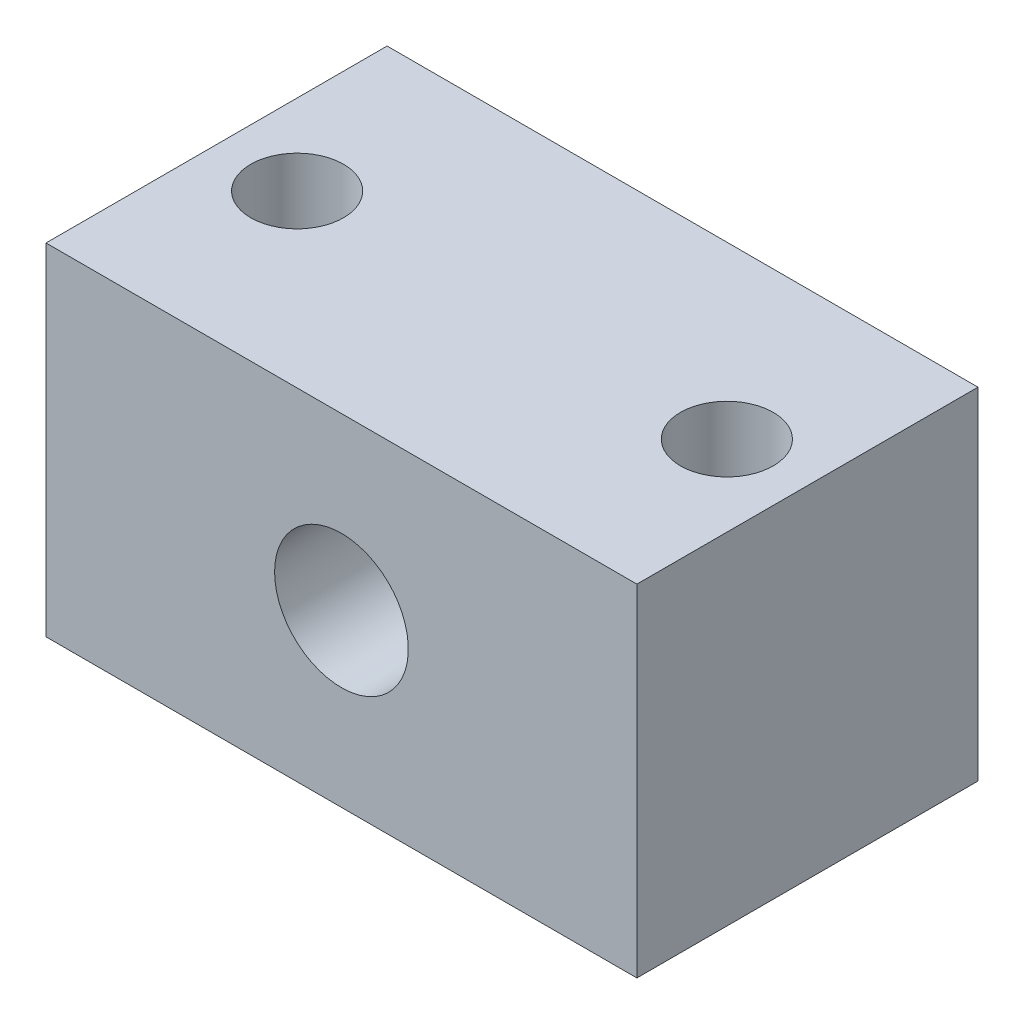
ISO-10303-21;
HEADER;
FILE_DESCRIPTION(('STEP AP214'),'2;1');
FILE_NAME('part.step','',(''),(''),'','','');
FILE_SCHEMA(('AUTOMOTIVE_DESIGN { 1 0 10303 214 1 1 1 1 }'));
ENDSEC;
DATA;
#1=APPLICATION_CONTEXT('core data for automotive mechanical design processes');
#2=APPLICATION_PROTOCOL_DEFINITION('international standard','automotive_design',2000,#1);
#3=PRODUCT_CONTEXT('',#1,'mechanical');
#4=PRODUCT('Part','Part','',(#3));
#5=PRODUCT_RELATED_PRODUCT_CATEGORY('part','',(#4));
#6=PRODUCT_DEFINITION_FORMATION('','',#4);
#7=PRODUCT_DEFINITION_CONTEXT('part definition',#1,'design');
#8=PRODUCT_DEFINITION('design','',#6,#7);
#9=PRODUCT_DEFINITION_SHAPE('','',#8);
#10=(LENGTH_UNIT() NAMED_UNIT(*) SI_UNIT(.MILLI.,.METRE.));
#11=(NAMED_UNIT(*) PLANE_ANGLE_UNIT() SI_UNIT($,.RADIAN.));
#12=(NAMED_UNIT(*) SI_UNIT($,.STERADIAN.) SOLID_ANGLE_UNIT());
#13=UNCERTAINTY_MEASURE_WITH_UNIT(LENGTH_MEASURE(1.E-05),#10,'distance_accuracy_value','');
#14=(GEOMETRIC_REPRESENTATION_CONTEXT(3) GLOBAL_UNCERTAINTY_ASSIGNED_CONTEXT((#13)) GLOBAL_UNIT_ASSIGNED_CONTEXT((#10,
#11,#12)) REPRESENTATION_CONTEXT('',''));
#15=CARTESIAN_POINT('',(0.,0.,0.));
#16=DIRECTION('',(0.,0.,1.));
#17=DIRECTION('',(1.,0.,0.));
#18=AXIS2_PLACEMENT_3D('',#15,#16,#17);
#19=CARTESIAN_POINT('',(0.,6.35,0.));
#20=DIRECTION('',(1.,0.,0.));
#21=DIRECTION('',(0.,0.,-1.));
#22=AXIS2_PLACEMENT_3D('',#19,#20,#21);
#23=PLANE('',#22);
#24=DIRECTION('',(0.,0.,1.));
#25=VECTOR('',#24,1.);
#26=CARTESIAN_POINT('',(0.,-6.35,0.));
#27=LINE('',#26,#25);
#28=CARTESIAN_POINT('',(0.,-6.35,-12.7));
#29=VERTEX_POINT('',#28);
#30=CARTESIAN_POINT('',(0.,-6.35,0.));
#31=VERTEX_POINT('',#30);
#32=EDGE_CURVE('E100',#29,#31,#27,.T.);
#33=ORIENTED_EDGE('',*,*,#32,.T.);
#34=DIRECTION('',(0.,-1.,0.));
#35=VECTOR('',#34,1.);
#36=CARTESIAN_POINT('',(0.,6.35,0.));
#37=LINE('',#36,#35);
#38=CARTESIAN_POINT('',(0.,6.35,0.));
#39=VERTEX_POINT('',#38);
#40=EDGE_CURVE('E11',#39,#31,#37,.T.);
#41=ORIENTED_EDGE('',*,*,#40,.F.);
#42=DIRECTION('',(0.,0.,1.));
#43=VECTOR('',#42,1.);
#44=CARTESIAN_POINT('',(0.,6.35,0.));
#45=LINE('',#44,#43);
#46=CARTESIAN_POINT('',(0.,6.35,-12.7));
#47=VERTEX_POINT('',#46);
#48=EDGE_CURVE('E88',#47,#39,#45,.T.);
#49=ORIENTED_EDGE('',*,*,#48,.F.);
#50=DIRECTION('',(0.,-1.,0.));
#51=VECTOR('',#50,1.);
#52=CARTESIAN_POINT('',(0.,6.35,-12.7));
#53=LINE('',#52,#51);
#54=EDGE_CURVE('E96',#47,#29,#53,.T.);
#55=ORIENTED_EDGE('',*,*,#54,.T.);
#56=EDGE_LOOP('',(#33,#41,#49,#55));
#57=FACE_BOUND('',#56,.T.);
#58=ADVANCED_FACE('F37',(#57),#23,.F.);
#59=CARTESIAN_POINT('',(0.,6.35,0.));
#60=DIRECTION('',(0.,0.,-1.));
#61=DIRECTION('',(-1.,0.,0.));
#62=AXIS2_PLACEMENT_3D('',#59,#60,#61);
#63=PLANE('',#62);
#64=CARTESIAN_POINT('',(11.000000048,0.,0.));
#65=DIRECTION('',(0.,0.,-1.));
#66=DIRECTION('',(-1.,0.,0.));
#67=AXIS2_PLACEMENT_3D('',#64,#65,#66);
#68=CIRCLE('',#67,2.4892);
#69=CARTESIAN_POINT('',(8.510800048,0.,0.));
#70=VERTEX_POINT('',#69);
#71=EDGE_CURVE('E125',#70,#70,#68,.T.);
#72=ORIENTED_EDGE('',*,*,#71,.T.);
#73=EDGE_LOOP('',(#72));
#74=FACE_BOUND('',#73,.T.);
#75=DIRECTION('',(1.,0.,0.));
#76=VECTOR('',#75,1.);
#77=CARTESIAN_POINT('',(0.,-6.35,0.));
#78=LINE('',#77,#76);
#79=CARTESIAN_POINT('',(22.000000096,-6.35,0.));
#80=VERTEX_POINT('',#79);
#81=EDGE_CURVE('E92',#31,#80,#78,.T.);
#82=ORIENTED_EDGE('',*,*,#81,.T.);
#83=DIRECTION('',(0.,-1.,0.));
#84=VECTOR('',#83,1.);
#85=CARTESIAN_POINT('',(22.000000096,6.35,0.));
#86=LINE('',#85,#84);
#87=CARTESIAN_POINT('',(22.000000096,6.35,0.));
#88=VERTEX_POINT('',#87);
#89=EDGE_CURVE('E45',#88,#80,#86,.T.);
#90=ORIENTED_EDGE('',*,*,#89,.F.);
#91=DIRECTION('',(1.,0.,0.));
#92=VECTOR('',#91,1.);
#93=CARTESIAN_POINT('',(0.,6.35,0.));
#94=LINE('',#93,#92);
#95=EDGE_CURVE('E83',#39,#88,#94,.T.);
#96=ORIENTED_EDGE('',*,*,#95,.F.);
#97=ORIENTED_EDGE('',*,*,#40,.T.);
#98=EDGE_LOOP('',(#82,#90,#96,#97));
#99=FACE_BOUND('',#98,.T.);
#100=ADVANCED_FACE('F91',(#74,#99),#63,.F.);
#101=CARTESIAN_POINT('',(22.000000096,6.35,0.));
#102=DIRECTION('',(-1.,0.,0.));
#103=DIRECTION('',(0.,0.,1.));
#104=AXIS2_PLACEMENT_3D('',#101,#102,#103);
#105=PLANE('',#104);
#106=DIRECTION('',(0.,0.,-1.));
#107=VECTOR('',#106,1.);
#108=CARTESIAN_POINT('',(22.000000096,-6.35,0.));
#109=LINE('',#108,#107);
#110=CARTESIAN_POINT('',(22.000000096,-6.35,-12.7));
#111=VERTEX_POINT('',#110);
#112=EDGE_CURVE('E70',#80,#111,#109,.T.);
#113=ORIENTED_EDGE('',*,*,#112,.T.);
#114=DIRECTION('',(0.,-1.,0.));
#115=VECTOR('',#114,1.);
#116=CARTESIAN_POINT('',(22.000000096,6.35,-12.7));
#117=LINE('',#116,#115);
#118=CARTESIAN_POINT('',(22.000000096,6.35,-12.7));
#119=VERTEX_POINT('',#118);
#120=EDGE_CURVE('E93',#119,#111,#117,.T.);
#121=ORIENTED_EDGE('',*,*,#120,.F.);
#122=DIRECTION('',(0.,0.,-1.));
#123=VECTOR('',#122,1.);
#124=CARTESIAN_POINT('',(22.000000096,6.35,0.));
#125=LINE('',#124,#123);
#126=EDGE_CURVE('E86',#88,#119,#125,.T.);
#127=ORIENTED_EDGE('',*,*,#126,.F.);
#128=ORIENTED_EDGE('',*,*,#89,.T.);
#129=EDGE_LOOP('',(#113,#121,#127,#128));
#130=FACE_BOUND('',#129,.T.);
#131=ADVANCED_FACE('F94',(#130),#105,.F.);
#132=CARTESIAN_POINT('',(0.,6.35,-12.7));
#133=DIRECTION('',(0.,0.,1.));
#134=DIRECTION('',(1.,0.,0.));
#135=AXIS2_PLACEMENT_3D('',#132,#133,#134);
#136=PLANE('',#135);
#137=CARTESIAN_POINT('',(11.000000048,0.,-12.7));
#138=DIRECTION('',(0.,0.,-1.));
#139=DIRECTION('',(-1.,0.,0.));
#140=AXIS2_PLACEMENT_3D('',#137,#138,#139);
#141=CIRCLE('',#140,2.4892);
#142=CARTESIAN_POINT('',(8.510800048,0.,-12.7));
#143=VERTEX_POINT('',#142);
#144=EDGE_CURVE('E126',#143,#143,#141,.T.);
#145=ORIENTED_EDGE('',*,*,#144,.F.);
#146=EDGE_LOOP('',(#145));
#147=FACE_BOUND('',#146,.T.);
#148=DIRECTION('',(-1.,0.,0.));
#149=VECTOR('',#148,1.);
#150=CARTESIAN_POINT('',(0.,-6.35,-12.7));
#151=LINE('',#150,#149);
#152=EDGE_CURVE('E76',#111,#29,#151,.T.);
#153=ORIENTED_EDGE('',*,*,#152,.T.);
#154=ORIENTED_EDGE('',*,*,#54,.F.);
#155=DIRECTION('',(-1.,0.,0.));
#156=VECTOR('',#155,1.);
#157=CARTESIAN_POINT('',(0.,6.35,-12.7));
#158=LINE('',#157,#156);
#159=EDGE_CURVE('E53',#119,#47,#158,.T.);
#160=ORIENTED_EDGE('',*,*,#159,.F.);
#161=ORIENTED_EDGE('',*,*,#120,.T.);
#162=EDGE_LOOP('',(#153,#154,#160,#161));
#163=FACE_BOUND('',#162,.T.);
#164=ADVANCED_FACE('F108',(#147,#163),#136,.F.);
#165=CARTESIAN_POINT('',(0.,6.35,0.));
#166=DIRECTION('',(0.,-1.,0.));
#167=DIRECTION('',(0.,0.,-1.));
#168=AXIS2_PLACEMENT_3D('',#165,#166,#167);
#169=PLANE('',#168);
#170=CARTESIAN_POINT('',(3.000000096,6.35,-6.35));
#171=DIRECTION('',(0.,1.,0.));
#172=DIRECTION('',(0.,0.,1.));
#173=AXIS2_PLACEMENT_3D('',#170,#171,#172);
#174=CIRCLE('',#173,1.7272);
#175=CARTESIAN_POINT('',(3.000000096,6.35,-4.6228));
#176=VERTEX_POINT('',#175);
#177=EDGE_CURVE('E122',#176,#176,#174,.T.);
#178=ORIENTED_EDGE('',*,*,#177,.F.);
#179=EDGE_LOOP('',(#178));
#180=FACE_BOUND('',#179,.T.);
#181=CARTESIAN_POINT('',(19.000000096,6.35,-6.35));
#182=DIRECTION('',(0.,1.,0.));
#183=DIRECTION('',(0.,0.,1.));
#184=AXIS2_PLACEMENT_3D('',#181,#182,#183);
#185=CIRCLE('',#184,1.7272);
#186=CARTESIAN_POINT('',(19.000000096,6.35,-4.6228));
#187=VERTEX_POINT('',#186);
#188=EDGE_CURVE('E116',#187,#187,#185,.T.);
#189=ORIENTED_EDGE('',*,*,#188,.F.);
#190=EDGE_LOOP('',(#189));
#191=FACE_BOUND('',#190,.T.);
#192=ORIENTED_EDGE('',*,*,#48,.T.);
#193=ORIENTED_EDGE('',*,*,#95,.T.);
#194=ORIENTED_EDGE('',*,*,#126,.T.);
#195=ORIENTED_EDGE('',*,*,#159,.T.);
#196=EDGE_LOOP('',(#192,#193,#194,#195));
#197=FACE_BOUND('',#196,.T.);
#198=ADVANCED_FACE('F84',(#180,#191,#197),#169,.F.);
#199=CARTESIAN_POINT('',(0.,-6.35,0.));
#200=DIRECTION('',(0.,-1.,0.));
#201=DIRECTION('',(0.,0.,-1.));
#202=AXIS2_PLACEMENT_3D('',#199,#200,#201);
#203=PLANE('',#202);
#204=CARTESIAN_POINT('',(3.000000096,-6.35,-6.35));
#205=DIRECTION('',(0.,1.,0.));
#206=DIRECTION('',(0.,0.,1.));
#207=AXIS2_PLACEMENT_3D('',#204,#205,#206);
#208=CIRCLE('',#207,1.7272);
#209=CARTESIAN_POINT('',(3.000000096,-6.35,-4.6228));
#210=VERTEX_POINT('',#209);
#211=EDGE_CURVE('E119',#210,#210,#208,.T.);
#212=ORIENTED_EDGE('',*,*,#211,.T.);
#213=EDGE_LOOP('',(#212));
#214=FACE_BOUND('',#213,.T.);
#215=CARTESIAN_POINT('',(19.000000096,-6.35,-6.35));
#216=DIRECTION('',(0.,1.,0.));
#217=DIRECTION('',(0.,0.,1.));
#218=AXIS2_PLACEMENT_3D('',#215,#216,#217);
#219=CIRCLE('',#218,1.7272);
#220=CARTESIAN_POINT('',(19.000000096,-6.35,-4.6228));
#221=VERTEX_POINT('',#220);
#222=EDGE_CURVE('E103',#221,#221,#219,.T.);
#223=ORIENTED_EDGE('',*,*,#222,.T.);
#224=EDGE_LOOP('',(#223));
#225=FACE_BOUND('',#224,.T.);
#226=ORIENTED_EDGE('',*,*,#32,.F.);
#227=ORIENTED_EDGE('',*,*,#152,.F.);
#228=ORIENTED_EDGE('',*,*,#112,.F.);
#229=ORIENTED_EDGE('',*,*,#81,.F.);
#230=EDGE_LOOP('',(#226,#227,#228,#229));
#231=FACE_BOUND('',#230,.T.);
#232=ADVANCED_FACE('F111',(#214,#225,#231),#203,.T.);
#233=CARTESIAN_POINT('',(19.000000096,6.35,-6.35));
#234=DIRECTION('',(0.,1.,0.));
#235=DIRECTION('',(0.,0.,1.));
#236=AXIS2_PLACEMENT_3D('',#233,#234,#235);
#237=CYLINDRICAL_SURFACE('',#236,1.7272);
#238=ORIENTED_EDGE('',*,*,#222,.F.);
#239=EDGE_LOOP('',(#238));
#240=FACE_BOUND('',#239,.T.);
#241=ORIENTED_EDGE('',*,*,#188,.T.);
#242=EDGE_LOOP('',(#241));
#243=FACE_BOUND('',#242,.T.);
#244=ADVANCED_FACE('F183',(#240,#243),#237,.F.);
#245=CARTESIAN_POINT('',(3.000000096,6.35,-6.35));
#246=DIRECTION('',(0.,1.,0.));
#247=DIRECTION('',(0.,0.,1.));
#248=AXIS2_PLACEMENT_3D('',#245,#246,#247);
#249=CYLINDRICAL_SURFACE('',#248,1.7272);
#250=ORIENTED_EDGE('',*,*,#211,.F.);
#251=EDGE_LOOP('',(#250));
#252=FACE_BOUND('',#251,.T.);
#253=ORIENTED_EDGE('',*,*,#177,.T.);
#254=EDGE_LOOP('',(#253));
#255=FACE_BOUND('',#254,.T.);
#256=ADVANCED_FACE('F136',(#252,#255),#249,.F.);
#257=CARTESIAN_POINT('',(11.000000048,0.,0.));
#258=DIRECTION('',(0.,0.,-1.));
#259=DIRECTION('',(-1.,0.,0.));
#260=AXIS2_PLACEMENT_3D('',#257,#258,#259);
#261=CYLINDRICAL_SURFACE('',#260,2.4892);
#262=ORIENTED_EDGE('',*,*,#71,.F.);
#263=EDGE_LOOP('',(#262));
#264=FACE_BOUND('',#263,.T.);
#265=ORIENTED_EDGE('',*,*,#144,.T.);
#266=EDGE_LOOP('',(#265));
#267=FACE_BOUND('',#266,.T.);
#268=ADVANCED_FACE('F133',(#264,#267),#261,.F.);
#269=CLOSED_SHELL('',(#58,#100,#131,#164,#198,#232,#244,#256,#268));
#270=MANIFOLD_SOLID_BREP('B2',#269);
#271=ADVANCED_BREP_SHAPE_REPRESENTATION('',(#18,#270),#14);
#272=SHAPE_DEFINITION_REPRESENTATION(#9,#271);
ENDSEC;
END-ISO-10303-21;
